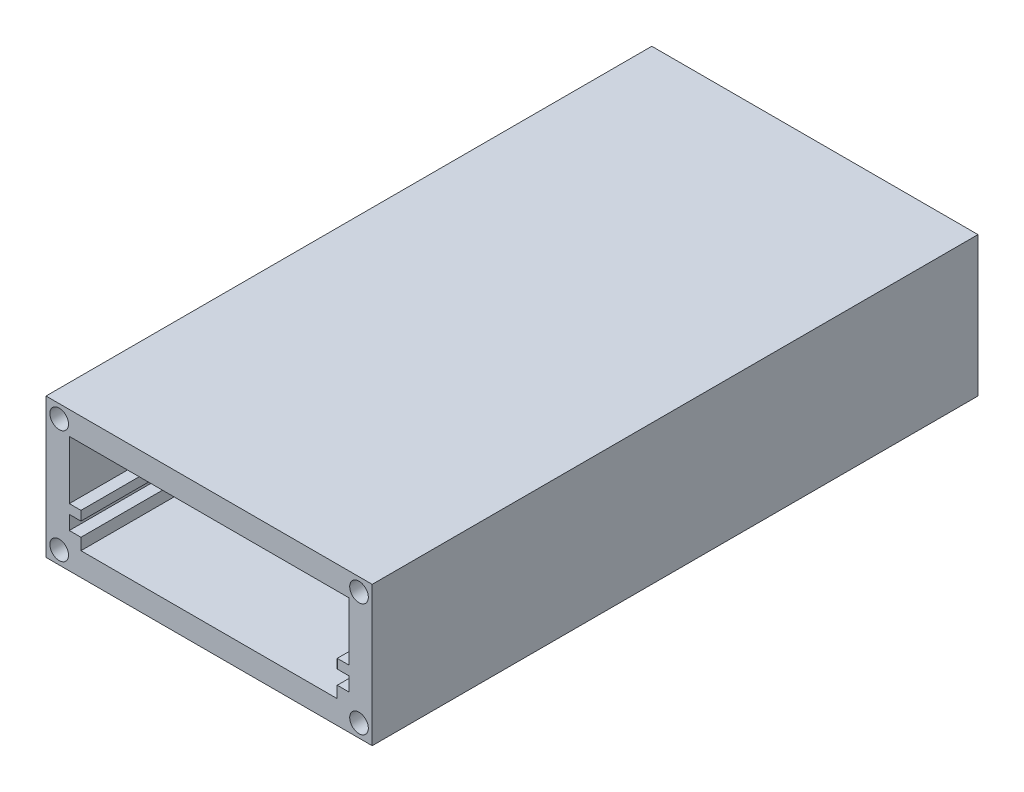
ISO-10303-21;
HEADER;
FILE_DESCRIPTION(('STEP AP214'),'2;1');
FILE_NAME('part.step','',(''),(''),'','','');
FILE_SCHEMA(('AUTOMOTIVE_DESIGN { 1 0 10303 214 1 1 1 1 }'));
ENDSEC;
DATA;
#1=APPLICATION_CONTEXT('core data for automotive mechanical design processes');
#2=APPLICATION_PROTOCOL_DEFINITION('international standard','automotive_design',2000,#1);
#3=PRODUCT_CONTEXT('',#1,'mechanical');
#4=PRODUCT('Part','Part','',(#3));
#5=PRODUCT_RELATED_PRODUCT_CATEGORY('part','',(#4));
#6=PRODUCT_DEFINITION_FORMATION('','',#4);
#7=PRODUCT_DEFINITION_CONTEXT('part definition',#1,'design');
#8=PRODUCT_DEFINITION('design','',#6,#7);
#9=PRODUCT_DEFINITION_SHAPE('','',#8);
#10=(LENGTH_UNIT() NAMED_UNIT(*) SI_UNIT(.MILLI.,.METRE.));
#11=(NAMED_UNIT(*) PLANE_ANGLE_UNIT() SI_UNIT($,.RADIAN.));
#12=(NAMED_UNIT(*) SI_UNIT($,.STERADIAN.) SOLID_ANGLE_UNIT());
#13=UNCERTAINTY_MEASURE_WITH_UNIT(LENGTH_MEASURE(1.E-05),#10,'distance_accuracy_value','');
#14=(GEOMETRIC_REPRESENTATION_CONTEXT(3) GLOBAL_UNCERTAINTY_ASSIGNED_CONTEXT((#13)) GLOBAL_UNIT_ASSIGNED_CONTEXT((#10,
#11,#12)) REPRESENTATION_CONTEXT('',''));
#15=CARTESIAN_POINT('',(0.,0.,0.));
#16=DIRECTION('',(0.,0.,1.));
#17=DIRECTION('',(1.,0.,0.));
#18=AXIS2_PLACEMENT_3D('',#15,#16,#17);
#19=CARTESIAN_POINT('',(0.,0.,-125.));
#20=DIRECTION('',(0.,0.,1.));
#21=DIRECTION('',(1.,0.,0.));
#22=AXIS2_PLACEMENT_3D('',#19,#20,#21);
#23=PLANE('',#22);
#24=DIRECTION('',(0.,1.,0.));
#25=VECTOR('',#24,1.);
#26=CARTESIAN_POINT('',(60.,5.,-125.));
#27=LINE('',#26,#25);
#28=CARTESIAN_POINT('',(60.,7.5,-125.));
#29=VERTEX_POINT('',#28);
#30=CARTESIAN_POINT('',(60.,10.5,-125.));
#31=VERTEX_POINT('',#30);
#32=EDGE_CURVE('E287',#29,#31,#27,.T.);
#33=ORIENTED_EDGE('',*,*,#32,.T.);
#34=DIRECTION('',(1.,0.,0.));
#35=VECTOR('',#34,1.);
#36=CARTESIAN_POINT('',(57.5,10.5,-125.));
#37=LINE('',#36,#35);
#38=CARTESIAN_POINT('',(57.5,10.5,-125.));
#39=VERTEX_POINT('',#38);
#40=EDGE_CURVE('E53',#39,#31,#37,.T.);
#41=ORIENTED_EDGE('',*,*,#40,.F.);
#42=DIRECTION('',(0.,-1.,0.));
#43=VECTOR('',#42,1.);
#44=CARTESIAN_POINT('',(57.5,12.5,-125.));
#45=LINE('',#44,#43);
#46=CARTESIAN_POINT('',(57.5,12.5,-125.));
#47=VERTEX_POINT('',#46);
#48=EDGE_CURVE('E58',#47,#39,#45,.T.);
#49=ORIENTED_EDGE('',*,*,#48,.F.);
#50=DIRECTION('',(1.,0.,0.));
#51=VECTOR('',#50,1.);
#52=CARTESIAN_POINT('',(57.5,12.5,-125.));
#53=LINE('',#52,#51);
#54=CARTESIAN_POINT('',(60.,12.5,-125.));
#55=VERTEX_POINT('',#54);
#56=EDGE_CURVE('E196',#47,#55,#53,.T.);
#57=ORIENTED_EDGE('',*,*,#56,.T.);
#58=CARTESIAN_POINT('',(60.,25.,-125.));
#59=VERTEX_POINT('',#58);
#60=EDGE_CURVE('E286',#55,#59,#27,.T.);
#61=ORIENTED_EDGE('',*,*,#60,.T.);
#62=DIRECTION('',(-1.,0.,0.));
#63=VECTOR('',#62,1.);
#64=CARTESIAN_POINT('',(60.,25.,-125.));
#65=LINE('',#64,#63);
#66=CARTESIAN_POINT('',(0.,25.,-125.));
#67=VERTEX_POINT('',#66);
#68=EDGE_CURVE('E276',#59,#67,#65,.T.);
#69=ORIENTED_EDGE('',*,*,#68,.T.);
#70=DIRECTION('',(0.,-1.,0.));
#71=VECTOR('',#70,1.);
#72=CARTESIAN_POINT('',(0.,25.,-125.));
#73=LINE('',#72,#71);
#74=CARTESIAN_POINT('',(0.,12.5,-125.));
#75=VERTEX_POINT('',#74);
#76=EDGE_CURVE('E280',#67,#75,#73,.T.);
#77=ORIENTED_EDGE('',*,*,#76,.T.);
#78=DIRECTION('',(-1.,0.,0.));
#79=VECTOR('',#78,1.);
#80=CARTESIAN_POINT('',(2.49999999999997,12.5,-125.));
#81=LINE('',#80,#79);
#82=CARTESIAN_POINT('',(2.49999999999997,12.5,-125.));
#83=VERTEX_POINT('',#82);
#84=EDGE_CURVE('E247',#83,#75,#81,.T.);
#85=ORIENTED_EDGE('',*,*,#84,.F.);
#86=DIRECTION('',(0.,1.,0.));
#87=VECTOR('',#86,1.);
#88=CARTESIAN_POINT('',(2.49999999999997,10.5,-125.));
#89=LINE('',#88,#87);
#90=CARTESIAN_POINT('',(2.49999999999997,10.5,-125.));
#91=VERTEX_POINT('',#90);
#92=EDGE_CURVE('E235',#91,#83,#89,.T.);
#93=ORIENTED_EDGE('',*,*,#92,.F.);
#94=DIRECTION('',(-1.,0.,0.));
#95=VECTOR('',#94,1.);
#96=CARTESIAN_POINT('',(2.49999999999997,10.5,-125.));
#97=LINE('',#96,#95);
#98=CARTESIAN_POINT('',(0.,10.5,-125.));
#99=VERTEX_POINT('',#98);
#100=EDGE_CURVE('E250',#91,#99,#97,.T.);
#101=ORIENTED_EDGE('',*,*,#100,.T.);
#102=CARTESIAN_POINT('',(0.,7.5,-125.));
#103=VERTEX_POINT('',#102);
#104=EDGE_CURVE('E278',#99,#103,#73,.T.);
#105=ORIENTED_EDGE('',*,*,#104,.T.);
#106=DIRECTION('',(-1.,0.,0.));
#107=VECTOR('',#106,1.);
#108=CARTESIAN_POINT('',(2.49999999999997,7.5,-125.));
#109=LINE('',#108,#107);
#110=CARTESIAN_POINT('',(2.49999999999997,7.5,-125.));
#111=VERTEX_POINT('',#110);
#112=EDGE_CURVE('E272',#111,#103,#109,.T.);
#113=ORIENTED_EDGE('',*,*,#112,.F.);
#114=DIRECTION('',(0.,1.,0.));
#115=VECTOR('',#114,1.);
#116=CARTESIAN_POINT('',(2.49999999999997,5.,-125.));
#117=LINE('',#116,#115);
#118=CARTESIAN_POINT('',(2.49999999999997,5.,-125.));
#119=VERTEX_POINT('',#118);
#120=EDGE_CURVE('E259',#119,#111,#117,.T.);
#121=ORIENTED_EDGE('',*,*,#120,.F.);
#122=DIRECTION('',(1.,0.,0.));
#123=VECTOR('',#122,1.);
#124=CARTESIAN_POINT('',(0.,5.,-125.));
#125=LINE('',#124,#123);
#126=CARTESIAN_POINT('',(57.5,5.,-125.));
#127=VERTEX_POINT('',#126);
#128=EDGE_CURVE('E283',#119,#127,#125,.T.);
#129=ORIENTED_EDGE('',*,*,#128,.T.);
#130=DIRECTION('',(0.,-1.,0.));
#131=VECTOR('',#130,1.);
#132=CARTESIAN_POINT('',(57.5,5.,-125.));
#133=LINE('',#132,#131);
#134=CARTESIAN_POINT('',(57.5,7.5,-125.));
#135=VERTEX_POINT('',#134);
#136=EDGE_CURVE('E217',#135,#127,#133,.T.);
#137=ORIENTED_EDGE('',*,*,#136,.F.);
#138=DIRECTION('',(1.,0.,0.));
#139=VECTOR('',#138,1.);
#140=CARTESIAN_POINT('',(57.5,7.5,-125.));
#141=LINE('',#140,#139);
#142=EDGE_CURVE('E220',#135,#29,#141,.T.);
#143=ORIENTED_EDGE('',*,*,#142,.T.);
#144=EDGE_LOOP('',(#33,#41,#49,#57,#61,#69,#77,#85,#93,#101,#105,#113,#121,#129,#137,#143));
#145=FACE_BOUND('',#144,.T.);
#146=ADVANCED_FACE('F38',(#145),#23,.T.);
#147=CARTESIAN_POINT('',(60.,5.,-125.));
#148=DIRECTION('',(1.,0.,0.));
#149=DIRECTION('',(0.,0.,-1.));
#150=AXIS2_PLACEMENT_3D('',#147,#148,#149);
#151=PLANE('',#150);
#152=DIRECTION('',(0.,0.,1.));
#153=VECTOR('',#152,1.);
#154=CARTESIAN_POINT('',(60.,10.5,-125.));
#155=LINE('',#154,#153);
#156=CARTESIAN_POINT('',(60.,10.5,0.));
#157=VERTEX_POINT('',#156);
#158=EDGE_CURVE('E185',#31,#157,#155,.T.);
#159=ORIENTED_EDGE('',*,*,#158,.F.);
#160=ORIENTED_EDGE('',*,*,#32,.F.);
#161=DIRECTION('',(0.,0.,-1.));
#162=VECTOR('',#161,1.);
#163=CARTESIAN_POINT('',(60.,7.5,-125.));
#164=LINE('',#163,#162);
#165=CARTESIAN_POINT('',(60.,7.5,0.));
#166=VERTEX_POINT('',#165);
#167=EDGE_CURVE('E208',#166,#29,#164,.T.);
#168=ORIENTED_EDGE('',*,*,#167,.F.);
#169=DIRECTION('',(0.,1.,0.));
#170=VECTOR('',#169,1.);
#171=CARTESIAN_POINT('',(60.,5.,0.));
#172=LINE('',#171,#170);
#173=EDGE_CURVE('E279',#166,#157,#172,.T.);
#174=ORIENTED_EDGE('',*,*,#173,.T.);
#175=EDGE_LOOP('',(#159,#160,#168,#174));
#176=FACE_BOUND('',#175,.T.);
#177=ADVANCED_FACE('F356',(#176),#151,.F.);
#178=DIRECTION('',(0.,0.,-1.));
#179=VECTOR('',#178,1.);
#180=CARTESIAN_POINT('',(60.,12.5,0.));
#181=LINE('',#180,#179);
#182=CARTESIAN_POINT('',(60.,12.5,0.));
#183=VERTEX_POINT('',#182);
#184=EDGE_CURVE('E201',#183,#55,#181,.T.);
#185=ORIENTED_EDGE('',*,*,#184,.F.);
#186=CARTESIAN_POINT('',(60.,25.,0.));
#187=VERTEX_POINT('',#186);
#188=EDGE_CURVE('E297',#183,#187,#172,.T.);
#189=ORIENTED_EDGE('',*,*,#188,.T.);
#190=DIRECTION('',(0.,0.,1.));
#191=VECTOR('',#190,1.);
#192=CARTESIAN_POINT('',(60.,25.,-125.));
#193=LINE('',#192,#191);
#194=EDGE_CURVE('E299',#59,#187,#193,.T.);
#195=ORIENTED_EDGE('',*,*,#194,.F.);
#196=ORIENTED_EDGE('',*,*,#60,.F.);
#197=EDGE_LOOP('',(#185,#189,#195,#196));
#198=FACE_BOUND('',#197,.T.);
#199=ADVANCED_FACE('F361',(#198),#151,.F.);
#200=CARTESIAN_POINT('',(0.,5.,-125.));
#201=DIRECTION('',(0.,-1.,0.));
#202=DIRECTION('',(0.,0.,-1.));
#203=AXIS2_PLACEMENT_3D('',#200,#201,#202);
#204=PLANE('',#203);
#205=DIRECTION('',(0.,0.,1.));
#206=VECTOR('',#205,1.);
#207=CARTESIAN_POINT('',(57.5,5.,0.));
#208=LINE('',#207,#206);
#209=CARTESIAN_POINT('',(57.5,5.,0.));
#210=VERTEX_POINT('',#209);
#211=EDGE_CURVE('E209',#127,#210,#208,.T.);
#212=ORIENTED_EDGE('',*,*,#211,.F.);
#213=ORIENTED_EDGE('',*,*,#128,.F.);
#214=DIRECTION('',(0.,0.,-1.));
#215=VECTOR('',#214,1.);
#216=CARTESIAN_POINT('',(2.49999999999997,5.,0.));
#217=LINE('',#216,#215);
#218=CARTESIAN_POINT('',(2.49999999999997,5.,0.));
#219=VERTEX_POINT('',#218);
#220=EDGE_CURVE('E256',#219,#119,#217,.T.);
#221=ORIENTED_EDGE('',*,*,#220,.F.);
#222=DIRECTION('',(1.,0.,0.));
#223=VECTOR('',#222,1.);
#224=CARTESIAN_POINT('',(0.,5.,0.));
#225=LINE('',#224,#223);
#226=EDGE_CURVE('E295',#219,#210,#225,.T.);
#227=ORIENTED_EDGE('',*,*,#226,.T.);
#228=EDGE_LOOP('',(#212,#213,#221,#227));
#229=FACE_BOUND('',#228,.T.);
#230=ADVANCED_FACE('F368',(#229),#204,.F.);
#231=CARTESIAN_POINT('',(0.,25.,-125.));
#232=DIRECTION('',(-1.,0.,0.));
#233=DIRECTION('',(0.,0.,1.));
#234=AXIS2_PLACEMENT_3D('',#231,#232,#233);
#235=PLANE('',#234);
#236=DIRECTION('',(0.,0.,-1.));
#237=VECTOR('',#236,1.);
#238=CARTESIAN_POINT('',(0.,10.5,0.));
#239=LINE('',#238,#237);
#240=CARTESIAN_POINT('',(0.,10.5,0.));
#241=VERTEX_POINT('',#240);
#242=EDGE_CURVE('E227',#241,#99,#239,.T.);
#243=ORIENTED_EDGE('',*,*,#242,.F.);
#244=DIRECTION('',(0.,-1.,0.));
#245=VECTOR('',#244,1.);
#246=CARTESIAN_POINT('',(0.,25.,0.));
#247=LINE('',#246,#245);
#248=CARTESIAN_POINT('',(0.,7.5,0.));
#249=VERTEX_POINT('',#248);
#250=EDGE_CURVE('E292',#241,#249,#247,.T.);
#251=ORIENTED_EDGE('',*,*,#250,.T.);
#252=DIRECTION('',(0.,0.,1.));
#253=VECTOR('',#252,1.);
#254=CARTESIAN_POINT('',(0.,7.5,-125.));
#255=LINE('',#254,#253);
#256=EDGE_CURVE('E255',#103,#249,#255,.T.);
#257=ORIENTED_EDGE('',*,*,#256,.F.);
#258=ORIENTED_EDGE('',*,*,#104,.F.);
#259=EDGE_LOOP('',(#243,#251,#257,#258));
#260=FACE_BOUND('',#259,.T.);
#261=ADVANCED_FACE('F352',(#260),#235,.F.);
#262=DIRECTION('',(0.,0.,1.));
#263=VECTOR('',#262,1.);
#264=CARTESIAN_POINT('',(0.,12.5,-125.));
#265=LINE('',#264,#263);
#266=CARTESIAN_POINT('',(0.,12.5,0.));
#267=VERTEX_POINT('',#266);
#268=EDGE_CURVE('E232',#75,#267,#265,.T.);
#269=ORIENTED_EDGE('',*,*,#268,.F.);
#270=ORIENTED_EDGE('',*,*,#76,.F.);
#271=DIRECTION('',(0.,0.,1.));
#272=VECTOR('',#271,1.);
#273=CARTESIAN_POINT('',(0.,25.,-125.));
#274=LINE('',#273,#272);
#275=CARTESIAN_POINT('',(0.,25.,0.));
#276=VERTEX_POINT('',#275);
#277=EDGE_CURVE('E289',#67,#276,#274,.T.);
#278=ORIENTED_EDGE('',*,*,#277,.T.);
#279=EDGE_CURVE('E293',#276,#267,#247,.T.);
#280=ORIENTED_EDGE('',*,*,#279,.T.);
#281=EDGE_LOOP('',(#269,#270,#278,#280));
#282=FACE_BOUND('',#281,.T.);
#283=ADVANCED_FACE('F347',(#282),#235,.F.);
#284=CARTESIAN_POINT('',(65.,30.,-130.));
#285=DIRECTION('',(-1.,0.,0.));
#286=DIRECTION('',(0.,0.,1.));
#287=AXIS2_PLACEMENT_3D('',#284,#285,#286);
#288=PLANE('',#287);
#289=DIRECTION('',(0.,0.,-1.));
#290=VECTOR('',#289,1.);
#291=CARTESIAN_POINT('',(65.,0.,-130.));
#292=LINE('',#291,#290);
#293=CARTESIAN_POINT('',(65.,0.,0.));
#294=VERTEX_POINT('',#293);
#295=CARTESIAN_POINT('',(65.,0.,-130.));
#296=VERTEX_POINT('',#295);
#297=EDGE_CURVE('E302',#294,#296,#292,.T.);
#298=ORIENTED_EDGE('',*,*,#297,.T.);
#299=DIRECTION('',(0.,-1.,0.));
#300=VECTOR('',#299,1.);
#301=CARTESIAN_POINT('',(65.,30.,-130.));
#302=LINE('',#301,#300);
#303=CARTESIAN_POINT('',(65.,30.,-130.));
#304=VERTEX_POINT('',#303);
#305=EDGE_CURVE('E46',#304,#296,#302,.T.);
#306=ORIENTED_EDGE('',*,*,#305,.F.);
#307=DIRECTION('',(0.,0.,-1.));
#308=VECTOR('',#307,1.);
#309=CARTESIAN_POINT('',(65.,30.,-130.));
#310=LINE('',#309,#308);
#311=CARTESIAN_POINT('',(65.,30.,0.));
#312=VERTEX_POINT('',#311);
#313=EDGE_CURVE('E307',#312,#304,#310,.T.);
#314=ORIENTED_EDGE('',*,*,#313,.F.);
#315=DIRECTION('',(0.,-1.,0.));
#316=VECTOR('',#315,1.);
#317=CARTESIAN_POINT('',(65.,30.,0.));
#318=LINE('',#317,#316);
#319=EDGE_CURVE('E11',#312,#294,#318,.T.);
#320=ORIENTED_EDGE('',*,*,#319,.T.);
#321=EDGE_LOOP('',(#298,#306,#314,#320));
#322=FACE_BOUND('',#321,.T.);
#323=ADVANCED_FACE('F40',(#322),#288,.F.);
#324=CARTESIAN_POINT('',(-5.00000000000002,30.,-130.));
#325=DIRECTION('',(0.,0.,1.));
#326=DIRECTION('',(1.,0.,0.));
#327=AXIS2_PLACEMENT_3D('',#324,#325,#326);
#328=PLANE('',#327);
#329=DIRECTION('',(-1.,0.,0.));
#330=VECTOR('',#329,1.);
#331=CARTESIAN_POINT('',(-5.00000000000002,0.,-130.));
#332=LINE('',#331,#330);
#333=CARTESIAN_POINT('',(-5.00000000000002,0.,-130.));
#334=VERTEX_POINT('',#333);
#335=EDGE_CURVE('E317',#296,#334,#332,.T.);
#336=ORIENTED_EDGE('',*,*,#335,.T.);
#337=DIRECTION('',(0.,-1.,0.));
#338=VECTOR('',#337,1.);
#339=CARTESIAN_POINT('',(-5.00000000000002,30.,-130.));
#340=LINE('',#339,#338);
#341=CARTESIAN_POINT('',(-5.00000000000002,30.,-130.));
#342=VERTEX_POINT('',#341);
#343=EDGE_CURVE('E324',#342,#334,#340,.T.);
#344=ORIENTED_EDGE('',*,*,#343,.F.);
#345=DIRECTION('',(-1.,0.,0.));
#346=VECTOR('',#345,1.);
#347=CARTESIAN_POINT('',(-5.00000000000002,30.,-130.));
#348=LINE('',#347,#346);
#349=EDGE_CURVE('E310',#304,#342,#348,.T.);
#350=ORIENTED_EDGE('',*,*,#349,.F.);
#351=ORIENTED_EDGE('',*,*,#305,.T.);
#352=EDGE_LOOP('',(#336,#344,#350,#351));
#353=FACE_BOUND('',#352,.T.);
#354=ADVANCED_FACE('F331',(#353),#328,.F.);
#355=CARTESIAN_POINT('',(-5.00000000000002,30.,-130.));
#356=DIRECTION('',(1.,0.,0.));
#357=DIRECTION('',(0.,0.,-1.));
#358=AXIS2_PLACEMENT_3D('',#355,#356,#357);
#359=PLANE('',#358);
#360=DIRECTION('',(0.,0.,1.));
#361=VECTOR('',#360,1.);
#362=CARTESIAN_POINT('',(-5.00000000000002,0.,-130.));
#363=LINE('',#362,#361);
#364=CARTESIAN_POINT('',(-5.,0.,0.));
#365=VERTEX_POINT('',#364);
#366=EDGE_CURVE('E319',#334,#365,#363,.T.);
#367=ORIENTED_EDGE('',*,*,#366,.T.);
#368=DIRECTION('',(0.,-1.,0.));
#369=VECTOR('',#368,1.);
#370=CARTESIAN_POINT('',(-5.,30.,0.));
#371=LINE('',#370,#369);
#372=CARTESIAN_POINT('',(-5.,30.,0.));
#373=VERTEX_POINT('',#372);
#374=EDGE_CURVE('E315',#373,#365,#371,.T.);
#375=ORIENTED_EDGE('',*,*,#374,.F.);
#376=DIRECTION('',(0.,0.,1.));
#377=VECTOR('',#376,1.);
#378=CARTESIAN_POINT('',(-5.00000000000002,30.,-130.));
#379=LINE('',#378,#377);
#380=EDGE_CURVE('E312',#342,#373,#379,.T.);
#381=ORIENTED_EDGE('',*,*,#380,.F.);
#382=ORIENTED_EDGE('',*,*,#343,.T.);
#383=EDGE_LOOP('',(#367,#375,#381,#382));
#384=FACE_BOUND('',#383,.T.);
#385=ADVANCED_FACE('F341',(#384),#359,.F.);
#386=CARTESIAN_POINT('',(-5.,30.,0.));
#387=DIRECTION('',(0.,0.,-1.));
#388=DIRECTION('',(-1.,0.,0.));
#389=AXIS2_PLACEMENT_3D('',#386,#387,#388);
#390=PLANE('',#389);
#391=CARTESIAN_POINT('',(62.1715728752538,27.1715728752538,0.));
#392=DIRECTION('',(0.,0.,1.));
#393=DIRECTION('',(1.,0.,0.));
#394=AXIS2_PLACEMENT_3D('',#391,#392,#393);
#395=CIRCLE('',#394,2.);
#396=CARTESIAN_POINT('',(64.1715728752538,27.1715728752538,0.));
#397=VERTEX_POINT('',#396);
#398=EDGE_CURVE('E580',#397,#397,#395,.T.);
#399=ORIENTED_EDGE('',*,*,#398,.F.);
#400=EDGE_LOOP('',(#399));
#401=FACE_BOUND('',#400,.T.);
#402=CARTESIAN_POINT('',(62.1715728752538,2.8284271247462,0.));
#403=DIRECTION('',(0.,0.,1.));
#404=DIRECTION('',(1.,0.,0.));
#405=AXIS2_PLACEMENT_3D('',#402,#403,#404);
#406=CIRCLE('',#405,2.);
#407=CARTESIAN_POINT('',(64.1715728752538,2.8284271247462,0.));
#408=VERTEX_POINT('',#407);
#409=EDGE_CURVE('E600',#408,#408,#406,.T.);
#410=ORIENTED_EDGE('',*,*,#409,.F.);
#411=EDGE_LOOP('',(#410));
#412=FACE_BOUND('',#411,.T.);
#413=CARTESIAN_POINT('',(-2.17157287525381,2.82842712474619,0.));
#414=DIRECTION('',(0.,0.,1.));
#415=DIRECTION('',(1.,0.,0.));
#416=AXIS2_PLACEMENT_3D('',#413,#414,#415);
#417=CIRCLE('',#416,2.);
#418=CARTESIAN_POINT('',(-0.17157287525381,2.82842712474619,0.));
#419=VERTEX_POINT('',#418);
#420=EDGE_CURVE('E591',#419,#419,#417,.T.);
#421=ORIENTED_EDGE('',*,*,#420,.F.);
#422=EDGE_LOOP('',(#421));
#423=FACE_BOUND('',#422,.T.);
#424=CARTESIAN_POINT('',(-2.17157287525381,27.1715728752538,0.));
#425=DIRECTION('',(0.,0.,1.));
#426=DIRECTION('',(1.,0.,0.));
#427=AXIS2_PLACEMENT_3D('',#424,#425,#426);
#428=CIRCLE('',#427,2.);
#429=CARTESIAN_POINT('',(-0.171572875253811,27.1715728752538,0.));
#430=VERTEX_POINT('',#429);
#431=EDGE_CURVE('E589',#430,#430,#428,.T.);
#432=ORIENTED_EDGE('',*,*,#431,.F.);
#433=EDGE_LOOP('',(#432));
#434=FACE_BOUND('',#433,.T.);
#435=ORIENTED_EDGE('',*,*,#173,.F.);
#436=DIRECTION('',(1.,0.,0.));
#437=VECTOR('',#436,1.);
#438=CARTESIAN_POINT('',(57.5,7.5,0.));
#439=LINE('',#438,#437);
#440=CARTESIAN_POINT('',(57.5,7.5,0.));
#441=VERTEX_POINT('',#440);
#442=EDGE_CURVE('E224',#441,#166,#439,.T.);
#443=ORIENTED_EDGE('',*,*,#442,.F.);
#444=DIRECTION('',(0.,1.,0.));
#445=VECTOR('',#444,1.);
#446=CARTESIAN_POINT('',(57.5,7.5,0.));
#447=LINE('',#446,#445);
#448=EDGE_CURVE('E212',#210,#441,#447,.T.);
#449=ORIENTED_EDGE('',*,*,#448,.F.);
#450=ORIENTED_EDGE('',*,*,#226,.F.);
#451=DIRECTION('',(0.,-1.,0.));
#452=VECTOR('',#451,1.);
#453=CARTESIAN_POINT('',(2.49999999999997,7.5,0.));
#454=LINE('',#453,#452);
#455=CARTESIAN_POINT('',(2.49999999999997,7.5,0.));
#456=VERTEX_POINT('',#455);
#457=EDGE_CURVE('E264',#456,#219,#454,.T.);
#458=ORIENTED_EDGE('',*,*,#457,.F.);
#459=DIRECTION('',(-1.,0.,0.));
#460=VECTOR('',#459,1.);
#461=CARTESIAN_POINT('',(2.49999999999997,7.5,0.));
#462=LINE('',#461,#460);
#463=EDGE_CURVE('E267',#456,#249,#462,.T.);
#464=ORIENTED_EDGE('',*,*,#463,.T.);
#465=ORIENTED_EDGE('',*,*,#250,.F.);
#466=DIRECTION('',(-1.,0.,0.));
#467=VECTOR('',#466,1.);
#468=CARTESIAN_POINT('',(2.49999999999997,10.5,0.));
#469=LINE('',#468,#467);
#470=CARTESIAN_POINT('',(2.49999999999997,10.5,0.));
#471=VERTEX_POINT('',#470);
#472=EDGE_CURVE('E252',#471,#241,#469,.T.);
#473=ORIENTED_EDGE('',*,*,#472,.F.);
#474=DIRECTION('',(0.,-1.,0.));
#475=VECTOR('',#474,1.);
#476=CARTESIAN_POINT('',(2.49999999999997,12.5,0.));
#477=LINE('',#476,#475);
#478=CARTESIAN_POINT('',(2.49999999999997,12.5,0.));
#479=VERTEX_POINT('',#478);
#480=EDGE_CURVE('E228',#479,#471,#477,.T.);
#481=ORIENTED_EDGE('',*,*,#480,.F.);
#482=DIRECTION('',(-1.,0.,0.));
#483=VECTOR('',#482,1.);
#484=CARTESIAN_POINT('',(2.49999999999997,12.5,0.));
#485=LINE('',#484,#483);
#486=EDGE_CURVE('E240',#479,#267,#485,.T.);
#487=ORIENTED_EDGE('',*,*,#486,.T.);
#488=ORIENTED_EDGE('',*,*,#279,.F.);
#489=DIRECTION('',(-1.,0.,0.));
#490=VECTOR('',#489,1.);
#491=CARTESIAN_POINT('',(24.7381266777886,25.,0.));
#492=LINE('',#491,#490);
#493=EDGE_CURVE('E275',#187,#276,#492,.T.);
#494=ORIENTED_EDGE('',*,*,#493,.F.);
#495=ORIENTED_EDGE('',*,*,#188,.F.);
#496=DIRECTION('',(1.,0.,0.));
#497=VECTOR('',#496,1.);
#498=CARTESIAN_POINT('',(57.5,12.5,0.));
#499=LINE('',#498,#497);
#500=CARTESIAN_POINT('',(57.5,12.5,0.));
#501=VERTEX_POINT('',#500);
#502=EDGE_CURVE('E188',#501,#183,#499,.T.);
#503=ORIENTED_EDGE('',*,*,#502,.F.);
#504=DIRECTION('',(0.,1.,0.));
#505=VECTOR('',#504,1.);
#506=CARTESIAN_POINT('',(57.5,10.5,0.));
#507=LINE('',#506,#505);
#508=CARTESIAN_POINT('',(57.5,10.5,0.));
#509=VERTEX_POINT('',#508);
#510=EDGE_CURVE('E177',#509,#501,#507,.T.);
#511=ORIENTED_EDGE('',*,*,#510,.F.);
#512=DIRECTION('',(1.,0.,0.));
#513=VECTOR('',#512,1.);
#514=CARTESIAN_POINT('',(57.5,10.5,0.));
#515=LINE('',#514,#513);
#516=EDGE_CURVE('E183',#509,#157,#515,.T.);
#517=ORIENTED_EDGE('',*,*,#516,.T.);
#518=EDGE_LOOP('',(#435,#443,#449,#450,#458,#464,#465,#473,#481,#487,#488,#494,#495,#503,#511,#517));
#519=FACE_BOUND('',#518,.T.);
#520=DIRECTION('',(1.,0.,0.));
#521=VECTOR('',#520,1.);
#522=CARTESIAN_POINT('',(-5.,0.,0.));
#523=LINE('',#522,#521);
#524=EDGE_CURVE('E308',#365,#294,#523,.T.);
#525=ORIENTED_EDGE('',*,*,#524,.T.);
#526=ORIENTED_EDGE('',*,*,#319,.F.);
#527=DIRECTION('',(1.,0.,0.));
#528=VECTOR('',#527,1.);
#529=CARTESIAN_POINT('',(0.,30.,0.));
#530=LINE('',#529,#528);
#531=EDGE_CURVE('E304',#373,#312,#530,.T.);
#532=ORIENTED_EDGE('',*,*,#531,.F.);
#533=ORIENTED_EDGE('',*,*,#374,.T.);
#534=EDGE_LOOP('',(#525,#526,#532,#533));
#535=FACE_BOUND('',#534,.T.);
#536=ADVANCED_FACE('F190',(#401,#412,#423,#434,#519,#535),#390,.F.);
#537=CARTESIAN_POINT('',(0.,30.,0.));
#538=DIRECTION('',(0.,-1.,0.));
#539=DIRECTION('',(0.,0.,-1.));
#540=AXIS2_PLACEMENT_3D('',#537,#538,#539);
#541=PLANE('',#540);
#542=ORIENTED_EDGE('',*,*,#531,.T.);
#543=ORIENTED_EDGE('',*,*,#313,.T.);
#544=ORIENTED_EDGE('',*,*,#349,.T.);
#545=ORIENTED_EDGE('',*,*,#380,.T.);
#546=EDGE_LOOP('',(#542,#543,#544,#545));
#547=FACE_BOUND('',#546,.T.);
#548=ADVANCED_FACE('F345',(#547),#541,.F.);
#549=CARTESIAN_POINT('',(0.,0.,0.));
#550=DIRECTION('',(0.,-1.,0.));
#551=DIRECTION('',(0.,0.,-1.));
#552=AXIS2_PLACEMENT_3D('',#549,#550,#551);
#553=PLANE('',#552);
#554=ORIENTED_EDGE('',*,*,#297,.F.);
#555=ORIENTED_EDGE('',*,*,#524,.F.);
#556=ORIENTED_EDGE('',*,*,#366,.F.);
#557=ORIENTED_EDGE('',*,*,#335,.F.);
#558=EDGE_LOOP('',(#554,#555,#556,#557));
#559=FACE_BOUND('',#558,.T.);
#560=ADVANCED_FACE('F337',(#559),#553,.T.);
#561=CARTESIAN_POINT('',(24.7381266777886,25.,-125.));
#562=DIRECTION('',(0.,1.,0.));
#563=DIRECTION('',(0.,0.,1.));
#564=AXIS2_PLACEMENT_3D('',#561,#562,#563);
#565=PLANE('',#564);
#566=ORIENTED_EDGE('',*,*,#493,.T.);
#567=ORIENTED_EDGE('',*,*,#277,.F.);
#568=ORIENTED_EDGE('',*,*,#68,.F.);
#569=ORIENTED_EDGE('',*,*,#194,.T.);
#570=EDGE_LOOP('',(#566,#567,#568,#569));
#571=FACE_BOUND('',#570,.T.);
#572=ADVANCED_FACE('F374',(#571),#565,.F.);
#573=CARTESIAN_POINT('',(2.49999999999997,7.5,-125.));
#574=DIRECTION('',(0.,-1.,0.));
#575=DIRECTION('',(0.,0.,-1.));
#576=AXIS2_PLACEMENT_3D('',#573,#574,#575);
#577=PLANE('',#576);
#578=ORIENTED_EDGE('',*,*,#256,.T.);
#579=ORIENTED_EDGE('',*,*,#463,.F.);
#580=DIRECTION('',(0.,0.,1.));
#581=VECTOR('',#580,1.);
#582=CARTESIAN_POINT('',(2.49999999999997,7.5,-125.));
#583=LINE('',#582,#581);
#584=EDGE_CURVE('E262',#111,#456,#583,.T.);
#585=ORIENTED_EDGE('',*,*,#584,.F.);
#586=ORIENTED_EDGE('',*,*,#112,.T.);
#587=EDGE_LOOP('',(#578,#579,#585,#586));
#588=FACE_BOUND('',#587,.T.);
#589=ADVANCED_FACE('F365',(#588),#577,.F.);
#590=CARTESIAN_POINT('',(2.49999999999997,0.,0.));
#591=DIRECTION('',(1.,0.,0.));
#592=DIRECTION('',(0.,0.,-1.));
#593=AXIS2_PLACEMENT_3D('',#590,#591,#592);
#594=PLANE('',#593);
#595=ORIENTED_EDGE('',*,*,#220,.T.);
#596=ORIENTED_EDGE('',*,*,#120,.T.);
#597=ORIENTED_EDGE('',*,*,#584,.T.);
#598=ORIENTED_EDGE('',*,*,#457,.T.);
#599=EDGE_LOOP('',(#595,#596,#597,#598));
#600=FACE_BOUND('',#599,.T.);
#601=ADVANCED_FACE('F419',(#600),#594,.T.);
#602=CARTESIAN_POINT('',(2.49999999999997,10.5,0.));
#603=DIRECTION('',(0.,1.,0.));
#604=DIRECTION('',(0.,0.,1.));
#605=AXIS2_PLACEMENT_3D('',#602,#603,#604);
#606=PLANE('',#605);
#607=ORIENTED_EDGE('',*,*,#242,.T.);
#608=ORIENTED_EDGE('',*,*,#100,.F.);
#609=DIRECTION('',(0.,0.,-1.));
#610=VECTOR('',#609,1.);
#611=CARTESIAN_POINT('',(2.49999999999997,10.5,0.));
#612=LINE('',#611,#610);
#613=EDGE_CURVE('E231',#471,#91,#612,.T.);
#614=ORIENTED_EDGE('',*,*,#613,.F.);
#615=ORIENTED_EDGE('',*,*,#472,.T.);
#616=EDGE_LOOP('',(#607,#608,#614,#615));
#617=FACE_BOUND('',#616,.T.);
#618=ADVANCED_FACE('F427',(#617),#606,.F.);
#619=CARTESIAN_POINT('',(2.49999999999997,12.5,-125.));
#620=DIRECTION('',(0.,-1.,0.));
#621=DIRECTION('',(0.,0.,-1.));
#622=AXIS2_PLACEMENT_3D('',#619,#620,#621);
#623=PLANE('',#622);
#624=ORIENTED_EDGE('',*,*,#268,.T.);
#625=ORIENTED_EDGE('',*,*,#486,.F.);
#626=DIRECTION('',(0.,0.,1.));
#627=VECTOR('',#626,1.);
#628=CARTESIAN_POINT('',(2.49999999999997,12.5,-125.));
#629=LINE('',#628,#627);
#630=EDGE_CURVE('E238',#83,#479,#629,.T.);
#631=ORIENTED_EDGE('',*,*,#630,.F.);
#632=ORIENTED_EDGE('',*,*,#84,.T.);
#633=EDGE_LOOP('',(#624,#625,#631,#632));
#634=FACE_BOUND('',#633,.T.);
#635=ADVANCED_FACE('F434',(#634),#623,.F.);
#636=CARTESIAN_POINT('',(2.49999999999997,0.,0.));
#637=DIRECTION('',(1.,0.,0.));
#638=DIRECTION('',(0.,0.,-1.));
#639=AXIS2_PLACEMENT_3D('',#636,#637,#638);
#640=PLANE('',#639);
#641=ORIENTED_EDGE('',*,*,#480,.T.);
#642=ORIENTED_EDGE('',*,*,#613,.T.);
#643=ORIENTED_EDGE('',*,*,#92,.T.);
#644=ORIENTED_EDGE('',*,*,#630,.T.);
#645=EDGE_LOOP('',(#641,#642,#643,#644));
#646=FACE_BOUND('',#645,.T.);
#647=ADVANCED_FACE('F442',(#646),#640,.T.);
#648=CARTESIAN_POINT('',(57.5,7.5,-125.));
#649=DIRECTION('',(0.,-1.,0.));
#650=DIRECTION('',(0.,0.,-1.));
#651=AXIS2_PLACEMENT_3D('',#648,#649,#650);
#652=PLANE('',#651);
#653=ORIENTED_EDGE('',*,*,#167,.T.);
#654=ORIENTED_EDGE('',*,*,#142,.F.);
#655=DIRECTION('',(0.,0.,-1.));
#656=VECTOR('',#655,1.);
#657=CARTESIAN_POINT('',(57.5,7.5,-125.));
#658=LINE('',#657,#656);
#659=EDGE_CURVE('E214',#441,#135,#658,.T.);
#660=ORIENTED_EDGE('',*,*,#659,.F.);
#661=ORIENTED_EDGE('',*,*,#442,.T.);
#662=EDGE_LOOP('',(#653,#654,#660,#661));
#663=FACE_BOUND('',#662,.T.);
#664=ADVANCED_FACE('F450',(#663),#652,.F.);
#665=CARTESIAN_POINT('',(57.5,0.,0.));
#666=DIRECTION('',(1.,0.,0.));
#667=DIRECTION('',(0.,0.,-1.));
#668=AXIS2_PLACEMENT_3D('',#665,#666,#667);
#669=PLANE('',#668);
#670=ORIENTED_EDGE('',*,*,#211,.T.);
#671=ORIENTED_EDGE('',*,*,#448,.T.);
#672=ORIENTED_EDGE('',*,*,#659,.T.);
#673=ORIENTED_EDGE('',*,*,#136,.T.);
#674=EDGE_LOOP('',(#670,#671,#672,#673));
#675=FACE_BOUND('',#674,.T.);
#676=ADVANCED_FACE('F458',(#675),#669,.F.);
#677=CARTESIAN_POINT('',(57.5,10.5,-125.));
#678=DIRECTION('',(0.,1.,0.));
#679=DIRECTION('',(0.,0.,1.));
#680=AXIS2_PLACEMENT_3D('',#677,#678,#679);
#681=PLANE('',#680);
#682=ORIENTED_EDGE('',*,*,#158,.T.);
#683=ORIENTED_EDGE('',*,*,#516,.F.);
#684=DIRECTION('',(0.,0.,1.));
#685=VECTOR('',#684,1.);
#686=CARTESIAN_POINT('',(57.5,10.5,-125.));
#687=LINE('',#686,#685);
#688=EDGE_CURVE('E173',#39,#509,#687,.T.);
#689=ORIENTED_EDGE('',*,*,#688,.F.);
#690=ORIENTED_EDGE('',*,*,#40,.T.);
#691=EDGE_LOOP('',(#682,#683,#689,#690));
#692=FACE_BOUND('',#691,.T.);
#693=ADVANCED_FACE('F184',(#692),#681,.F.);
#694=CARTESIAN_POINT('',(57.5,12.5,0.));
#695=DIRECTION('',(0.,-1.,0.));
#696=DIRECTION('',(0.,0.,-1.));
#697=AXIS2_PLACEMENT_3D('',#694,#695,#696);
#698=PLANE('',#697);
#699=ORIENTED_EDGE('',*,*,#184,.T.);
#700=ORIENTED_EDGE('',*,*,#56,.F.);
#701=DIRECTION('',(0.,0.,-1.));
#702=VECTOR('',#701,1.);
#703=CARTESIAN_POINT('',(57.5,12.5,0.));
#704=LINE('',#703,#702);
#705=EDGE_CURVE('E194',#501,#47,#704,.T.);
#706=ORIENTED_EDGE('',*,*,#705,.F.);
#707=ORIENTED_EDGE('',*,*,#502,.T.);
#708=EDGE_LOOP('',(#699,#700,#706,#707));
#709=FACE_BOUND('',#708,.T.);
#710=ADVANCED_FACE('F473',(#709),#698,.F.);
#711=CARTESIAN_POINT('',(57.5,0.,0.));
#712=DIRECTION('',(-1.,0.,0.));
#713=DIRECTION('',(0.,0.,1.));
#714=AXIS2_PLACEMENT_3D('',#711,#712,#713);
#715=PLANE('',#714);
#716=ORIENTED_EDGE('',*,*,#48,.T.);
#717=ORIENTED_EDGE('',*,*,#688,.T.);
#718=ORIENTED_EDGE('',*,*,#510,.T.);
#719=ORIENTED_EDGE('',*,*,#705,.T.);
#720=EDGE_LOOP('',(#716,#717,#718,#719));
#721=FACE_BOUND('',#720,.T.);
#722=ADVANCED_FACE('F175',(#721),#715,.T.);
#723=CARTESIAN_POINT('',(-2.17157287525381,27.1715728752538,-20.));
#724=DIRECTION('',(0.,0.,1.));
#725=DIRECTION('',(1.,0.,0.));
#726=AXIS2_PLACEMENT_3D('',#723,#724,#725);
#727=CYLINDRICAL_SURFACE('',#726,2.);
#728=CARTESIAN_POINT('',(-2.17157287525381,27.1715728752538,-20.));
#729=DIRECTION('',(0.,0.,1.));
#730=DIRECTION('',(1.,0.,0.));
#731=AXIS2_PLACEMENT_3D('',#728,#729,#730);
#732=CIRCLE('',#731,2.);
#733=CARTESIAN_POINT('',(-0.171572875253811,27.1715728752538,-20.));
#734=VERTEX_POINT('',#733);
#735=EDGE_CURVE('E202',#734,#734,#732,.T.);
#736=ORIENTED_EDGE('',*,*,#735,.F.);
#737=EDGE_LOOP('',(#736));
#738=FACE_BOUND('',#737,.T.);
#739=ORIENTED_EDGE('',*,*,#431,.T.);
#740=EDGE_LOOP('',(#739));
#741=FACE_BOUND('',#740,.T.);
#742=ADVANCED_FACE('F486',(#738,#741),#727,.F.);
#743=CARTESIAN_POINT('',(-2.17157287525381,27.1715728752538,-20.));
#744=DIRECTION('',(0.,0.,1.));
#745=DIRECTION('',(1.,0.,0.));
#746=AXIS2_PLACEMENT_3D('',#743,#744,#745);
#747=PLANE('',#746);
#748=ORIENTED_EDGE('',*,*,#735,.T.);
#749=EDGE_LOOP('',(#748));
#750=FACE_BOUND('',#749,.T.);
#751=ADVANCED_FACE('F492',(#750),#747,.T.);
#752=CARTESIAN_POINT('',(-2.17157287525381,2.82842712474619,-20.));
#753=DIRECTION('',(0.,0.,1.));
#754=DIRECTION('',(1.,0.,0.));
#755=AXIS2_PLACEMENT_3D('',#752,#753,#754);
#756=CYLINDRICAL_SURFACE('',#755,2.);
#757=CARTESIAN_POINT('',(-2.17157287525381,2.82842712474619,-20.));
#758=DIRECTION('',(0.,0.,1.));
#759=DIRECTION('',(1.,0.,0.));
#760=AXIS2_PLACEMENT_3D('',#757,#758,#759);
#761=CIRCLE('',#760,2.);
#762=CARTESIAN_POINT('',(-0.17157287525381,2.82842712474619,-20.));
#763=VERTEX_POINT('',#762);
#764=EDGE_CURVE('E595',#763,#763,#761,.T.);
#765=ORIENTED_EDGE('',*,*,#764,.F.);
#766=EDGE_LOOP('',(#765));
#767=FACE_BOUND('',#766,.T.);
#768=ORIENTED_EDGE('',*,*,#420,.T.);
#769=EDGE_LOOP('',(#768));
#770=FACE_BOUND('',#769,.T.);
#771=ADVANCED_FACE('F500',(#767,#770),#756,.F.);
#772=CARTESIAN_POINT('',(-2.17157287525381,2.82842712474619,-20.));
#773=DIRECTION('',(0.,0.,1.));
#774=DIRECTION('',(1.,0.,0.));
#775=AXIS2_PLACEMENT_3D('',#772,#773,#774);
#776=PLANE('',#775);
#777=ORIENTED_EDGE('',*,*,#764,.T.);
#778=EDGE_LOOP('',(#777));
#779=FACE_BOUND('',#778,.T.);
#780=ADVANCED_FACE('F508',(#779),#776,.T.);
#781=CARTESIAN_POINT('',(62.1715728752538,2.8284271247462,-20.));
#782=DIRECTION('',(0.,0.,1.));
#783=DIRECTION('',(1.,0.,0.));
#784=AXIS2_PLACEMENT_3D('',#781,#782,#783);
#785=CYLINDRICAL_SURFACE('',#784,2.);
#786=CARTESIAN_POINT('',(62.1715728752538,2.8284271247462,-20.));
#787=DIRECTION('',(0.,0.,1.));
#788=DIRECTION('',(1.,0.,0.));
#789=AXIS2_PLACEMENT_3D('',#786,#787,#788);
#790=CIRCLE('',#789,2.);
#791=CARTESIAN_POINT('',(64.1715728752538,2.8284271247462,-20.));
#792=VERTEX_POINT('',#791);
#793=EDGE_CURVE('E583',#792,#792,#790,.T.);
#794=ORIENTED_EDGE('',*,*,#793,.F.);
#795=EDGE_LOOP('',(#794));
#796=FACE_BOUND('',#795,.T.);
#797=ORIENTED_EDGE('',*,*,#409,.T.);
#798=EDGE_LOOP('',(#797));
#799=FACE_BOUND('',#798,.T.);
#800=ADVANCED_FACE('F516',(#796,#799),#785,.F.);
#801=CARTESIAN_POINT('',(62.1715728752538,2.8284271247462,-20.));
#802=DIRECTION('',(0.,0.,1.));
#803=DIRECTION('',(1.,0.,0.));
#804=AXIS2_PLACEMENT_3D('',#801,#802,#803);
#805=PLANE('',#804);
#806=ORIENTED_EDGE('',*,*,#793,.T.);
#807=EDGE_LOOP('',(#806));
#808=FACE_BOUND('',#807,.T.);
#809=ADVANCED_FACE('F524',(#808),#805,.T.);
#810=CARTESIAN_POINT('',(62.1715728752538,27.1715728752538,-20.));
#811=DIRECTION('',(0.,0.,1.));
#812=DIRECTION('',(1.,0.,0.));
#813=AXIS2_PLACEMENT_3D('',#810,#811,#812);
#814=CYLINDRICAL_SURFACE('',#813,2.);
#815=CARTESIAN_POINT('',(62.1715728752538,27.1715728752538,-20.));
#816=DIRECTION('',(0.,0.,1.));
#817=DIRECTION('',(1.,0.,0.));
#818=AXIS2_PLACEMENT_3D('',#815,#816,#817);
#819=CIRCLE('',#818,2.);
#820=CARTESIAN_POINT('',(64.1715728752538,27.1715728752538,-20.));
#821=VERTEX_POINT('',#820);
#822=EDGE_CURVE('E579',#821,#821,#819,.T.);
#823=ORIENTED_EDGE('',*,*,#822,.F.);
#824=EDGE_LOOP('',(#823));
#825=FACE_BOUND('',#824,.T.);
#826=ORIENTED_EDGE('',*,*,#398,.T.);
#827=EDGE_LOOP('',(#826));
#828=FACE_BOUND('',#827,.T.);
#829=ADVANCED_FACE('F532',(#825,#828),#814,.F.);
#830=CARTESIAN_POINT('',(62.1715728752538,27.1715728752538,-20.));
#831=DIRECTION('',(0.,0.,1.));
#832=DIRECTION('',(1.,0.,0.));
#833=AXIS2_PLACEMENT_3D('',#830,#831,#832);
#834=PLANE('',#833);
#835=ORIENTED_EDGE('',*,*,#822,.T.);
#836=EDGE_LOOP('',(#835));
#837=FACE_BOUND('',#836,.T.);
#838=ADVANCED_FACE('F540',(#837),#834,.T.);
#839=CLOSED_SHELL('',(#146,#177,#199,#230,#261,#283,#323,#354,#385,#536,#548,#560,#572,#589,
#601,#618,#635,#647,#664,#676,#693,#710,#722,#742,#751,#771,#780,#800,#809,#829,#838));
#840=MANIFOLD_SOLID_BREP('B2',#839);
#841=ADVANCED_BREP_SHAPE_REPRESENTATION('',(#18,#840),#14);
#842=SHAPE_DEFINITION_REPRESENTATION(#9,#841);
ENDSEC;
END-ISO-10303-21;
